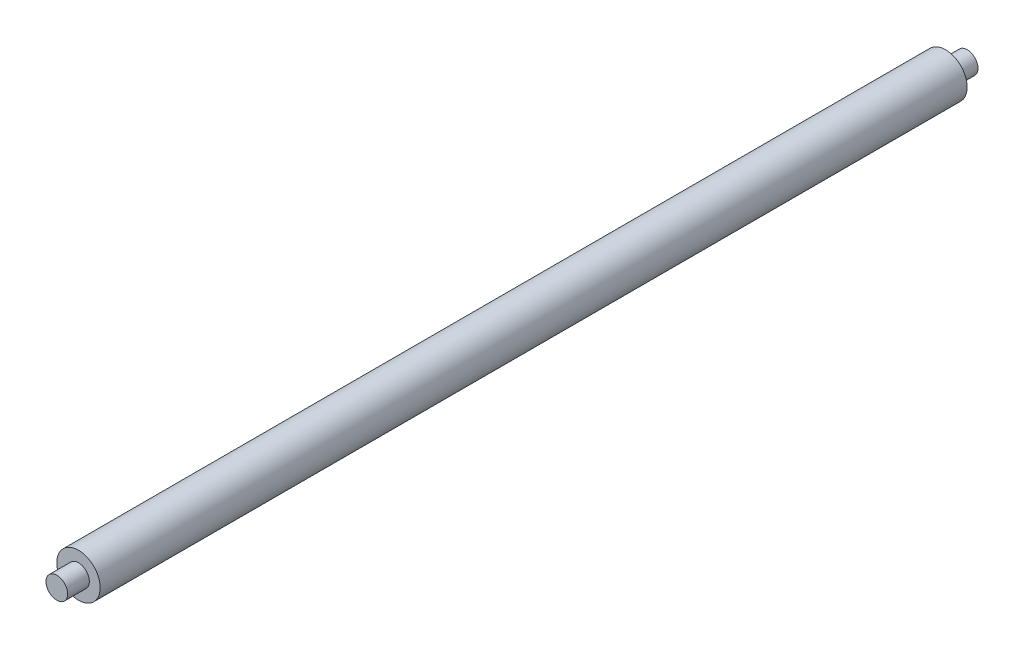
ISO-10303-21;
HEADER;
FILE_DESCRIPTION(('STEP AP214'),'2;1');
FILE_NAME('part.step','',(''),(''),'','','');
FILE_SCHEMA(('AUTOMOTIVE_DESIGN { 1 0 10303 214 1 1 1 1 }'));
ENDSEC;
DATA;
#1=APPLICATION_CONTEXT('core data for automotive mechanical design processes');
#2=APPLICATION_PROTOCOL_DEFINITION('international standard','automotive_design',2000,#1);
#3=PRODUCT_CONTEXT('',#1,'mechanical');
#4=PRODUCT('Part','Part','',(#3));
#5=PRODUCT_RELATED_PRODUCT_CATEGORY('part','',(#4));
#6=PRODUCT_DEFINITION_FORMATION('','',#4);
#7=PRODUCT_DEFINITION_CONTEXT('part definition',#1,'design');
#8=PRODUCT_DEFINITION('design','',#6,#7);
#9=PRODUCT_DEFINITION_SHAPE('','',#8);
#10=(LENGTH_UNIT() NAMED_UNIT(*) SI_UNIT(.MILLI.,.METRE.));
#11=(NAMED_UNIT(*) PLANE_ANGLE_UNIT() SI_UNIT($,.RADIAN.));
#12=(NAMED_UNIT(*) SI_UNIT($,.STERADIAN.) SOLID_ANGLE_UNIT());
#13=UNCERTAINTY_MEASURE_WITH_UNIT(LENGTH_MEASURE(1.E-05),#10,'distance_accuracy_value','');
#14=(GEOMETRIC_REPRESENTATION_CONTEXT(3) GLOBAL_UNCERTAINTY_ASSIGNED_CONTEXT((#13)) GLOBAL_UNIT_ASSIGNED_CONTEXT((#10,
#11,#12)) REPRESENTATION_CONTEXT('',''));
#15=CARTESIAN_POINT('',(0.,0.,0.));
#16=DIRECTION('',(0.,0.,1.));
#17=DIRECTION('',(1.,0.,0.));
#18=AXIS2_PLACEMENT_3D('',#15,#16,#17);
#19=CARTESIAN_POINT('',(0.,0.,100.));
#20=DIRECTION('',(0.,0.,-1.));
#21=DIRECTION('',(-1.,0.,0.));
#22=AXIS2_PLACEMENT_3D('',#19,#20,#21);
#23=CYLINDRICAL_SURFACE('',#22,5.);
#24=CARTESIAN_POINT('',(0.,0.,100.));
#25=DIRECTION('',(0.,0.,1.));
#26=DIRECTION('',(1.,0.,0.));
#27=AXIS2_PLACEMENT_3D('',#24,#25,#26);
#28=CIRCLE('',#27,5.);
#29=CARTESIAN_POINT('',(5.,0.,100.));
#30=VERTEX_POINT('',#29);
#31=EDGE_CURVE('E37',#30,#30,#28,.T.);
#32=ORIENTED_EDGE('',*,*,#31,.F.);
#33=EDGE_LOOP('',(#32));
#34=FACE_BOUND('',#33,.T.);
#35=CARTESIAN_POINT('',(0.,0.,-100.));
#36=DIRECTION('',(0.,0.,1.));
#37=DIRECTION('',(1.,0.,0.));
#38=AXIS2_PLACEMENT_3D('',#35,#36,#37);
#39=CIRCLE('',#38,5.);
#40=CARTESIAN_POINT('',(5.,0.,-100.));
#41=VERTEX_POINT('',#40);
#42=EDGE_CURVE('E33',#41,#41,#39,.T.);
#43=ORIENTED_EDGE('',*,*,#42,.T.);
#44=EDGE_LOOP('',(#43));
#45=FACE_BOUND('',#44,.T.);
#46=ADVANCED_FACE('F30',(#34,#45),#23,.T.);
#47=CARTESIAN_POINT('',(0.,0.,100.));
#48=DIRECTION('',(0.,0.,1.));
#49=DIRECTION('',(1.,0.,0.));
#50=AXIS2_PLACEMENT_3D('',#47,#48,#49);
#51=PLANE('',#50);
#52=CARTESIAN_POINT('',(0.,0.,100.));
#53=DIRECTION('',(0.,0.,1.));
#54=DIRECTION('',(1.,0.,0.));
#55=AXIS2_PLACEMENT_3D('',#52,#53,#54);
#56=CIRCLE('',#55,2.5);
#57=CARTESIAN_POINT('',(2.5,0.,100.));
#58=VERTEX_POINT('',#57);
#59=EDGE_CURVE('E10',#58,#58,#56,.T.);
#60=ORIENTED_EDGE('',*,*,#59,.F.);
#61=EDGE_LOOP('',(#60));
#62=FACE_BOUND('',#61,.T.);
#63=ORIENTED_EDGE('',*,*,#31,.T.);
#64=EDGE_LOOP('',(#63));
#65=FACE_BOUND('',#64,.T.);
#66=ADVANCED_FACE('F65',(#62,#65),#51,.T.);
#67=CARTESIAN_POINT('',(0.,0.,-100.));
#68=DIRECTION('',(0.,0.,1.));
#69=DIRECTION('',(1.,0.,0.));
#70=AXIS2_PLACEMENT_3D('',#67,#68,#69);
#71=PLANE('',#70);
#72=CARTESIAN_POINT('',(0.,0.,-100.));
#73=DIRECTION('',(0.,0.,1.));
#74=DIRECTION('',(1.,0.,0.));
#75=AXIS2_PLACEMENT_3D('',#72,#73,#74);
#76=CIRCLE('',#75,2.5);
#77=CARTESIAN_POINT('',(2.5,0.,-100.));
#78=VERTEX_POINT('',#77);
#79=EDGE_CURVE('E47',#78,#78,#76,.T.);
#80=ORIENTED_EDGE('',*,*,#79,.T.);
#81=EDGE_LOOP('',(#80));
#82=FACE_BOUND('',#81,.T.);
#83=ORIENTED_EDGE('',*,*,#42,.F.);
#84=EDGE_LOOP('',(#83));
#85=FACE_BOUND('',#84,.T.);
#86=ADVANCED_FACE('F70',(#82,#85),#71,.F.);
#87=CARTESIAN_POINT('',(0.,0.,105.));
#88=DIRECTION('',(0.,0.,-1.));
#89=DIRECTION('',(-1.,0.,0.));
#90=AXIS2_PLACEMENT_3D('',#87,#88,#89);
#91=CYLINDRICAL_SURFACE('',#90,2.5);
#92=CARTESIAN_POINT('',(0.,0.,105.));
#93=DIRECTION('',(0.,0.,1.));
#94=DIRECTION('',(1.,0.,0.));
#95=AXIS2_PLACEMENT_3D('',#92,#93,#94);
#96=CIRCLE('',#95,2.5);
#97=CARTESIAN_POINT('',(2.5,0.,105.));
#98=VERTEX_POINT('',#97);
#99=EDGE_CURVE('E43',#98,#98,#96,.T.);
#100=ORIENTED_EDGE('',*,*,#99,.F.);
#101=EDGE_LOOP('',(#100));
#102=FACE_BOUND('',#101,.T.);
#103=ORIENTED_EDGE('',*,*,#59,.T.);
#104=EDGE_LOOP('',(#103));
#105=FACE_BOUND('',#104,.T.);
#106=ADVANCED_FACE('F79',(#102,#105),#91,.T.);
#107=CARTESIAN_POINT('',(0.,0.,105.));
#108=DIRECTION('',(0.,0.,1.));
#109=DIRECTION('',(1.,0.,0.));
#110=AXIS2_PLACEMENT_3D('',#107,#108,#109);
#111=PLANE('',#110);
#112=ORIENTED_EDGE('',*,*,#99,.T.);
#113=EDGE_LOOP('',(#112));
#114=FACE_BOUND('',#113,.T.);
#115=ADVANCED_FACE('F62',(#114),#111,.T.);
#116=CARTESIAN_POINT('',(0.,0.,-105.));
#117=DIRECTION('',(0.,0.,1.));
#118=DIRECTION('',(1.,0.,0.));
#119=AXIS2_PLACEMENT_3D('',#116,#117,#118);
#120=CYLINDRICAL_SURFACE('',#119,2.5);
#121=CARTESIAN_POINT('',(0.,0.,-105.));
#122=DIRECTION('',(0.,0.,1.));
#123=DIRECTION('',(1.,0.,0.));
#124=AXIS2_PLACEMENT_3D('',#121,#122,#123);
#125=CIRCLE('',#124,2.5);
#126=CARTESIAN_POINT('',(2.5,0.,-105.));
#127=VERTEX_POINT('',#126);
#128=EDGE_CURVE('E46',#127,#127,#125,.T.);
#129=ORIENTED_EDGE('',*,*,#128,.T.);
#130=EDGE_LOOP('',(#129));
#131=FACE_BOUND('',#130,.T.);
#132=ORIENTED_EDGE('',*,*,#79,.F.);
#133=EDGE_LOOP('',(#132));
#134=FACE_BOUND('',#133,.T.);
#135=ADVANCED_FACE('F53',(#131,#134),#120,.T.);
#136=CARTESIAN_POINT('',(0.,0.,-105.));
#137=DIRECTION('',(0.,0.,-1.));
#138=DIRECTION('',(1.,0.,0.));
#139=AXIS2_PLACEMENT_3D('',#136,#137,#138);
#140=PLANE('',#139);
#141=ORIENTED_EDGE('',*,*,#128,.F.);
#142=EDGE_LOOP('',(#141));
#143=FACE_BOUND('',#142,.T.);
#144=ADVANCED_FACE('F56',(#143),#140,.T.);
#145=CLOSED_SHELL('',(#46,#66,#86,#106,#115,#135,#144));
#146=MANIFOLD_SOLID_BREP('B2',#145);
#147=ADVANCED_BREP_SHAPE_REPRESENTATION('',(#18,#146),#14);
#148=SHAPE_DEFINITION_REPRESENTATION(#9,#147);
ENDSEC;
END-ISO-10303-21;
